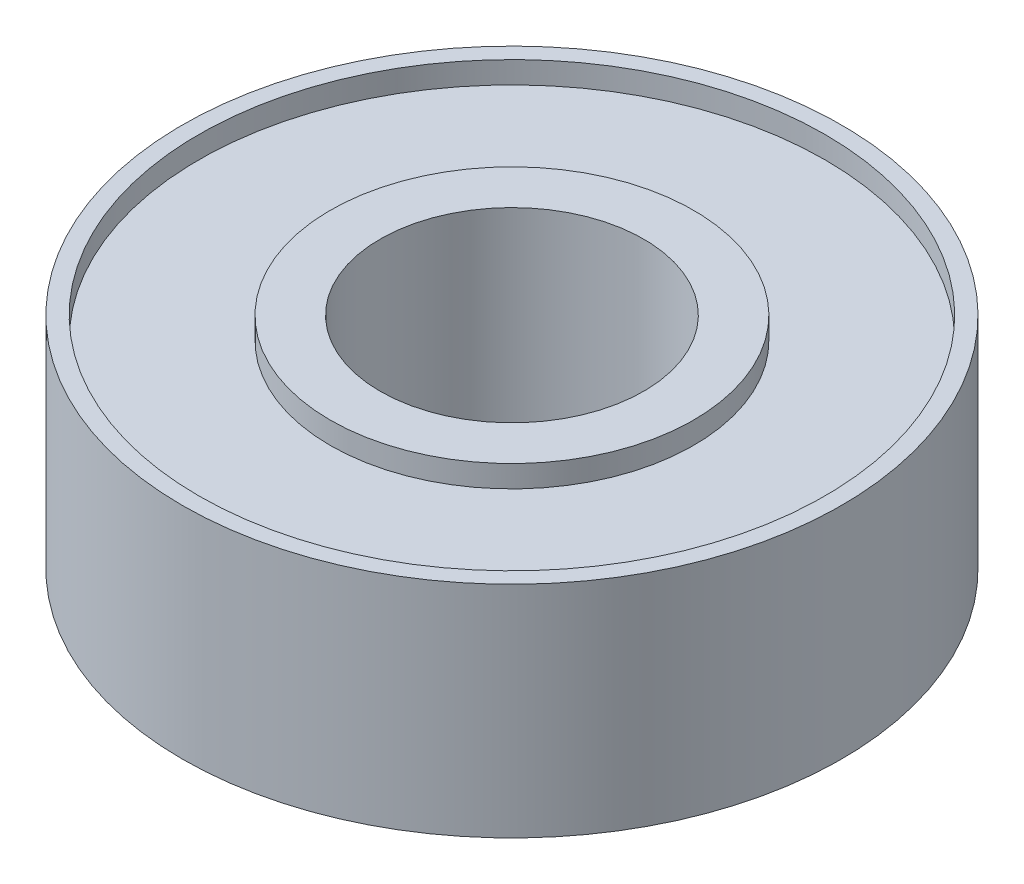
ISO-10303-21;
HEADER;
FILE_DESCRIPTION(('STEP AP214'),'2;1');
FILE_NAME('part.step','',(''),(''),'','','');
FILE_SCHEMA(('AUTOMOTIVE_DESIGN { 1 0 10303 214 1 1 1 1 }'));
ENDSEC;
DATA;
#1=APPLICATION_CONTEXT('core data for automotive mechanical design processes');
#2=APPLICATION_PROTOCOL_DEFINITION('international standard','automotive_design',2000,#1);
#3=PRODUCT_CONTEXT('',#1,'mechanical');
#4=PRODUCT('Part','Part','',(#3));
#5=PRODUCT_RELATED_PRODUCT_CATEGORY('part','',(#4));
#6=PRODUCT_DEFINITION_FORMATION('','',#4);
#7=PRODUCT_DEFINITION_CONTEXT('part definition',#1,'design');
#8=PRODUCT_DEFINITION('design','',#6,#7);
#9=PRODUCT_DEFINITION_SHAPE('','',#8);
#10=(LENGTH_UNIT() NAMED_UNIT(*) SI_UNIT(.MILLI.,.METRE.));
#11=(NAMED_UNIT(*) PLANE_ANGLE_UNIT() SI_UNIT($,.RADIAN.));
#12=(NAMED_UNIT(*) SI_UNIT($,.STERADIAN.) SOLID_ANGLE_UNIT());
#13=UNCERTAINTY_MEASURE_WITH_UNIT(LENGTH_MEASURE(1.E-05),#10,'distance_accuracy_value','');
#14=(GEOMETRIC_REPRESENTATION_CONTEXT(3) GLOBAL_UNCERTAINTY_ASSIGNED_CONTEXT((#13)) GLOBAL_UNIT_ASSIGNED_CONTEXT((#10,
#11,#12)) REPRESENTATION_CONTEXT('',''));
#15=CARTESIAN_POINT('',(0.,0.,0.));
#16=DIRECTION('',(0.,0.,1.));
#17=DIRECTION('',(1.,0.,0.));
#18=AXIS2_PLACEMENT_3D('',#15,#16,#17);
#19=CARTESIAN_POINT('',(0.,0.,0.));
#20=DIRECTION('',(0.,1.,0.));
#21=DIRECTION('',(0.,0.,1.));
#22=AXIS2_PLACEMENT_3D('',#19,#20,#21);
#23=PLANE('',#22);
#24=CARTESIAN_POINT('',(0.,0.,0.));
#25=DIRECTION('',(0.,1.,0.));
#26=DIRECTION('',(0.,0.,1.));
#27=AXIS2_PLACEMENT_3D('',#24,#25,#26);
#28=CIRCLE('',#27,3.);
#29=CARTESIAN_POINT('',(0.,0.,3.));
#30=VERTEX_POINT('',#29);
#31=EDGE_CURVE('E64',#30,#30,#28,.T.);
#32=ORIENTED_EDGE('',*,*,#31,.T.);
#33=EDGE_LOOP('',(#32));
#34=FACE_BOUND('',#33,.T.);
#35=CARTESIAN_POINT('',(0.,0.,0.));
#36=DIRECTION('',(0.,-1.,0.));
#37=DIRECTION('',(0.,0.,-1.));
#38=AXIS2_PLACEMENT_3D('',#35,#36,#37);
#39=CIRCLE('',#38,3.5416491528608);
#40=CARTESIAN_POINT('',(0.,0.,-3.5416491528608));
#41=VERTEX_POINT('',#40);
#42=EDGE_CURVE('E92',#41,#41,#39,.T.);
#43=ORIENTED_EDGE('',*,*,#42,.T.);
#44=EDGE_LOOP('',(#43));
#45=FACE_BOUND('',#44,.T.);
#46=ADVANCED_FACE('F50',(#34,#45),#23,.F.);
#47=CARTESIAN_POINT('',(0.,5.,0.));
#48=DIRECTION('',(0.,1.,0.));
#49=DIRECTION('',(0.,0.,1.));
#50=AXIS2_PLACEMENT_3D('',#47,#48,#49);
#51=PLANE('',#50);
#52=CARTESIAN_POINT('',(0.,5.,0.));
#53=DIRECTION('',(0.,1.,0.));
#54=DIRECTION('',(0.,0.,1.));
#55=AXIS2_PLACEMENT_3D('',#52,#53,#54);
#56=CIRCLE('',#55,3.);
#57=CARTESIAN_POINT('',(0.,5.,3.));
#58=VERTEX_POINT('',#57);
#59=EDGE_CURVE('E61',#58,#58,#56,.T.);
#60=ORIENTED_EDGE('',*,*,#59,.F.);
#61=EDGE_LOOP('',(#60));
#62=FACE_BOUND('',#61,.T.);
#63=CARTESIAN_POINT('',(0.,5.,0.));
#64=DIRECTION('',(0.,1.,0.));
#65=DIRECTION('',(0.,0.,1.));
#66=AXIS2_PLACEMENT_3D('',#63,#64,#65);
#67=CIRCLE('',#66,4.13518393027883);
#68=CARTESIAN_POINT('',(0.,5.,4.13518393027883));
#69=VERTEX_POINT('',#68);
#70=EDGE_CURVE('E78',#69,#69,#67,.T.);
#71=ORIENTED_EDGE('',*,*,#70,.T.);
#72=EDGE_LOOP('',(#71));
#73=FACE_BOUND('',#72,.T.);
#74=ADVANCED_FACE('F134',(#62,#73),#51,.T.);
#75=CARTESIAN_POINT('',(0.,5.,0.));
#76=DIRECTION('',(0.,1.,0.));
#77=DIRECTION('',(0.,0.,1.));
#78=AXIS2_PLACEMENT_3D('',#75,#76,#77);
#79=CIRCLE('',#78,7.12490046355672);
#80=CARTESIAN_POINT('',(0.,5.,7.12490046355672));
#81=VERTEX_POINT('',#80);
#82=EDGE_CURVE('E72',#81,#81,#79,.T.);
#83=ORIENTED_EDGE('',*,*,#82,.F.);
#84=EDGE_LOOP('',(#83));
#85=FACE_BOUND('',#84,.T.);
#86=CARTESIAN_POINT('',(0.,5.,0.));
#87=DIRECTION('',(0.,1.,0.));
#88=DIRECTION('',(0.,0.,1.));
#89=AXIS2_PLACEMENT_3D('',#86,#87,#88);
#90=CIRCLE('',#89,7.5);
#91=CARTESIAN_POINT('',(0.,5.,7.5));
#92=VERTEX_POINT('',#91);
#93=EDGE_CURVE('E10',#92,#92,#90,.T.);
#94=ORIENTED_EDGE('',*,*,#93,.T.);
#95=EDGE_LOOP('',(#94));
#96=FACE_BOUND('',#95,.T.);
#97=ADVANCED_FACE('F122',(#85,#96),#51,.T.);
#98=CARTESIAN_POINT('',(0.,0.,0.));
#99=DIRECTION('',(0.,-1.,0.));
#100=DIRECTION('',(0.,0.,-1.));
#101=AXIS2_PLACEMENT_3D('',#98,#99,#100);
#102=CIRCLE('',#101,6.92702201573982);
#103=CARTESIAN_POINT('',(0.,0.,-6.92702201573982));
#104=VERTEX_POINT('',#103);
#105=EDGE_CURVE('E87',#104,#104,#102,.T.);
#106=ORIENTED_EDGE('',*,*,#105,.F.);
#107=EDGE_LOOP('',(#106));
#108=FACE_BOUND('',#107,.T.);
#109=CARTESIAN_POINT('',(0.,0.,0.));
#110=DIRECTION('',(0.,1.,0.));
#111=DIRECTION('',(0.,0.,1.));
#112=AXIS2_PLACEMENT_3D('',#109,#110,#111);
#113=CIRCLE('',#112,7.5);
#114=CARTESIAN_POINT('',(0.,0.,7.5));
#115=VERTEX_POINT('',#114);
#116=EDGE_CURVE('E51',#115,#115,#113,.T.);
#117=ORIENTED_EDGE('',*,*,#116,.F.);
#118=EDGE_LOOP('',(#117));
#119=FACE_BOUND('',#118,.T.);
#120=ADVANCED_FACE('F119',(#108,#119),#23,.F.);
#121=CARTESIAN_POINT('',(0.,5.,0.));
#122=DIRECTION('',(0.,-1.,0.));
#123=DIRECTION('',(0.,0.,-1.));
#124=AXIS2_PLACEMENT_3D('',#121,#122,#123);
#125=CYLINDRICAL_SURFACE('',#124,7.5);
#126=ORIENTED_EDGE('',*,*,#93,.F.);
#127=EDGE_LOOP('',(#126));
#128=FACE_BOUND('',#127,.T.);
#129=ORIENTED_EDGE('',*,*,#116,.T.);
#130=EDGE_LOOP('',(#129));
#131=FACE_BOUND('',#130,.T.);
#132=ADVANCED_FACE('F47',(#128,#131),#125,.T.);
#133=CARTESIAN_POINT('',(0.,5.,0.));
#134=DIRECTION('',(0.,-1.,0.));
#135=DIRECTION('',(0.,0.,-1.));
#136=AXIS2_PLACEMENT_3D('',#133,#134,#135);
#137=CYLINDRICAL_SURFACE('',#136,3.);
#138=ORIENTED_EDGE('',*,*,#59,.T.);
#139=EDGE_LOOP('',(#138));
#140=FACE_BOUND('',#139,.T.);
#141=ORIENTED_EDGE('',*,*,#31,.F.);
#142=EDGE_LOOP('',(#141));
#143=FACE_BOUND('',#142,.T.);
#144=ADVANCED_FACE('F121',(#140,#143),#137,.F.);
#145=CARTESIAN_POINT('',(0.,4.5,0.));
#146=DIRECTION('',(0.,1.,0.));
#147=DIRECTION('',(0.,0.,1.));
#148=AXIS2_PLACEMENT_3D('',#145,#146,#147);
#149=CYLINDRICAL_SURFACE('',#148,7.12490046355672);
#150=CARTESIAN_POINT('',(0.,4.5,0.));
#151=DIRECTION('',(0.,1.,0.));
#152=DIRECTION('',(0.,0.,1.));
#153=AXIS2_PLACEMENT_3D('',#150,#151,#152);
#154=CIRCLE('',#153,7.12490046355672);
#155=CARTESIAN_POINT('',(0.,4.5,7.12490046355672));
#156=VERTEX_POINT('',#155);
#157=EDGE_CURVE('E70',#156,#156,#154,.T.);
#158=ORIENTED_EDGE('',*,*,#157,.F.);
#159=EDGE_LOOP('',(#158));
#160=FACE_BOUND('',#159,.T.);
#161=ORIENTED_EDGE('',*,*,#82,.T.);
#162=EDGE_LOOP('',(#161));
#163=FACE_BOUND('',#162,.T.);
#164=ADVANCED_FACE('F129',(#160,#163),#149,.F.);
#165=CARTESIAN_POINT('',(0.,4.5,0.));
#166=DIRECTION('',(0.,1.,0.));
#167=DIRECTION('',(0.,0.,1.));
#168=AXIS2_PLACEMENT_3D('',#165,#166,#167);
#169=PLANE('',#168);
#170=CARTESIAN_POINT('',(0.,4.5,0.));
#171=DIRECTION('',(0.,1.,0.));
#172=DIRECTION('',(0.,0.,1.));
#173=AXIS2_PLACEMENT_3D('',#170,#171,#172);
#174=CIRCLE('',#173,4.13518393027883);
#175=CARTESIAN_POINT('',(0.,4.5,4.13518393027883));
#176=VERTEX_POINT('',#175);
#177=EDGE_CURVE('E73',#176,#176,#174,.T.);
#178=ORIENTED_EDGE('',*,*,#177,.F.);
#179=EDGE_LOOP('',(#178));
#180=FACE_BOUND('',#179,.T.);
#181=ORIENTED_EDGE('',*,*,#157,.T.);
#182=EDGE_LOOP('',(#181));
#183=FACE_BOUND('',#182,.T.);
#184=ADVANCED_FACE('F144',(#180,#183),#169,.T.);
#185=CARTESIAN_POINT('',(0.,4.5,0.));
#186=DIRECTION('',(0.,1.,0.));
#187=DIRECTION('',(0.,0.,1.));
#188=AXIS2_PLACEMENT_3D('',#185,#186,#187);
#189=CYLINDRICAL_SURFACE('',#188,4.13518393027883);
#190=ORIENTED_EDGE('',*,*,#177,.T.);
#191=EDGE_LOOP('',(#190));
#192=FACE_BOUND('',#191,.T.);
#193=ORIENTED_EDGE('',*,*,#70,.F.);
#194=EDGE_LOOP('',(#193));
#195=FACE_BOUND('',#194,.T.);
#196=ADVANCED_FACE('F111',(#192,#195),#189,.T.);
#197=CARTESIAN_POINT('',(0.,0.5,0.));
#198=DIRECTION('',(0.,-1.,0.));
#199=DIRECTION('',(0.,0.,-1.));
#200=AXIS2_PLACEMENT_3D('',#197,#198,#199);
#201=CYLINDRICAL_SURFACE('',#200,6.92702201573982);
#202=CARTESIAN_POINT('',(0.,0.5,0.));
#203=DIRECTION('',(0.,-1.,0.));
#204=DIRECTION('',(0.,0.,-1.));
#205=AXIS2_PLACEMENT_3D('',#202,#203,#204);
#206=CIRCLE('',#205,6.92702201573982);
#207=CARTESIAN_POINT('',(0.,0.5,-6.92702201573982));
#208=VERTEX_POINT('',#207);
#209=EDGE_CURVE('E83',#208,#208,#206,.T.);
#210=ORIENTED_EDGE('',*,*,#209,.F.);
#211=EDGE_LOOP('',(#210));
#212=FACE_BOUND('',#211,.T.);
#213=ORIENTED_EDGE('',*,*,#105,.T.);
#214=EDGE_LOOP('',(#213));
#215=FACE_BOUND('',#214,.T.);
#216=ADVANCED_FACE('F107',(#212,#215),#201,.F.);
#217=CARTESIAN_POINT('',(0.,0.5,0.));
#218=DIRECTION('',(0.,-1.,0.));
#219=DIRECTION('',(0.,0.,-1.));
#220=AXIS2_PLACEMENT_3D('',#217,#218,#219);
#221=PLANE('',#220);
#222=CARTESIAN_POINT('',(0.,0.5,0.));
#223=DIRECTION('',(0.,-1.,0.));
#224=DIRECTION('',(0.,0.,-1.));
#225=AXIS2_PLACEMENT_3D('',#222,#223,#224);
#226=CIRCLE('',#225,3.5416491528608);
#227=CARTESIAN_POINT('',(0.,0.5,-3.5416491528608));
#228=VERTEX_POINT('',#227);
#229=EDGE_CURVE('E93',#228,#228,#226,.T.);
#230=ORIENTED_EDGE('',*,*,#229,.F.);
#231=EDGE_LOOP('',(#230));
#232=FACE_BOUND('',#231,.T.);
#233=ORIENTED_EDGE('',*,*,#209,.T.);
#234=EDGE_LOOP('',(#233));
#235=FACE_BOUND('',#234,.T.);
#236=ADVANCED_FACE('F104',(#232,#235),#221,.T.);
#237=CARTESIAN_POINT('',(0.,0.5,0.));
#238=DIRECTION('',(0.,-1.,0.));
#239=DIRECTION('',(0.,0.,-1.));
#240=AXIS2_PLACEMENT_3D('',#237,#238,#239);
#241=CYLINDRICAL_SURFACE('',#240,3.5416491528608);
#242=ORIENTED_EDGE('',*,*,#229,.T.);
#243=EDGE_LOOP('',(#242));
#244=FACE_BOUND('',#243,.T.);
#245=ORIENTED_EDGE('',*,*,#42,.F.);
#246=EDGE_LOOP('',(#245));
#247=FACE_BOUND('',#246,.T.);
#248=ADVANCED_FACE('F105',(#244,#247),#241,.T.);
#249=CLOSED_SHELL('',(#46,#74,#97,#120,#132,#144,#164,#184,#196,#216,#236,#248));
#250=MANIFOLD_SOLID_BREP('B2',#249);
#251=ADVANCED_BREP_SHAPE_REPRESENTATION('',(#18,#250),#14);
#252=SHAPE_DEFINITION_REPRESENTATION(#9,#251);
ENDSEC;
END-ISO-10303-21;
